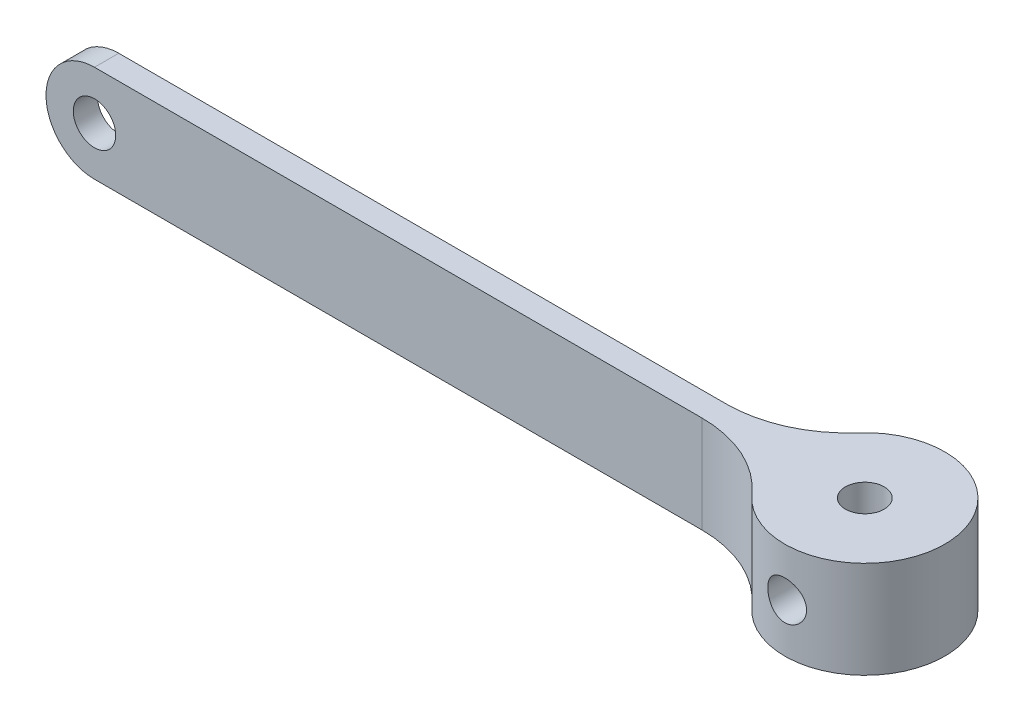
ISO-10303-21;
HEADER;
FILE_DESCRIPTION(('STEP AP214'),'2;1');
FILE_NAME('part.step','',(''),(''),'','','');
FILE_SCHEMA(('AUTOMOTIVE_DESIGN { 1 0 10303 214 1 1 1 1 }'));
ENDSEC;
DATA;
#1=APPLICATION_CONTEXT('core data for automotive mechanical design processes');
#2=APPLICATION_PROTOCOL_DEFINITION('international standard','automotive_design',2000,#1);
#3=PRODUCT_CONTEXT('',#1,'mechanical');
#4=PRODUCT('Part','Part','',(#3));
#5=PRODUCT_RELATED_PRODUCT_CATEGORY('part','',(#4));
#6=PRODUCT_DEFINITION_FORMATION('','',#4);
#7=PRODUCT_DEFINITION_CONTEXT('part definition',#1,'design');
#8=PRODUCT_DEFINITION('design','',#6,#7);
#9=PRODUCT_DEFINITION_SHAPE('','',#8);
#10=(LENGTH_UNIT() NAMED_UNIT(*) SI_UNIT(.MILLI.,.METRE.));
#11=(NAMED_UNIT(*) PLANE_ANGLE_UNIT() SI_UNIT($,.RADIAN.));
#12=(NAMED_UNIT(*) SI_UNIT($,.STERADIAN.) SOLID_ANGLE_UNIT());
#13=UNCERTAINTY_MEASURE_WITH_UNIT(LENGTH_MEASURE(1.E-05),#10,'distance_accuracy_value','');
#14=(GEOMETRIC_REPRESENTATION_CONTEXT(3) GLOBAL_UNCERTAINTY_ASSIGNED_CONTEXT((#13)) GLOBAL_UNIT_ASSIGNED_CONTEXT((#10,
#11,#12)) REPRESENTATION_CONTEXT('',''));
#15=CARTESIAN_POINT('',(0.,0.,0.));
#16=DIRECTION('',(0.,0.,1.));
#17=DIRECTION('',(1.,0.,0.));
#18=AXIS2_PLACEMENT_3D('',#15,#16,#17);
#19=CARTESIAN_POINT('',(0.,8.,-0.999999999999998));
#20=DIRECTION('',(0.,0.,-1.));
#21=DIRECTION('',(-1.,0.,0.));
#22=AXIS2_PLACEMENT_3D('',#19,#20,#21);
#23=PLANE('',#22);
#24=CARTESIAN_POINT('',(-62.52380257212,4.,-0.999999999999998));
#25=DIRECTION('',(0.,0.,-1.));
#26=DIRECTION('',(-1.,0.,0.));
#27=AXIS2_PLACEMENT_3D('',#24,#25,#26);
#28=CIRCLE('',#27,1.75);
#29=CARTESIAN_POINT('',(-60.77380257212,4.,-0.999999999999998));
#30=VERTEX_POINT('',#29);
#31=EDGE_CURVE('E208',#30,#30,#28,.T.);
#32=ORIENTED_EDGE('',*,*,#31,.F.);
#33=EDGE_LOOP('',(#32));
#34=FACE_BOUND('',#33,.T.);
#35=DIRECTION('',(1.,0.,0.));
#36=VECTOR('',#35,1.);
#37=CARTESIAN_POINT('',(0.,8.,-0.999999999999998));
#38=LINE('',#37,#36);
#39=CARTESIAN_POINT('',(-62.52380257212,8.,-1.));
#40=VERTEX_POINT('',#39);
#41=CARTESIAN_POINT('',(-12.432216214336,8.,-0.999999999999998));
#42=VERTEX_POINT('',#41);
#43=EDGE_CURVE('E299',#40,#42,#38,.T.);
#44=ORIENTED_EDGE('',*,*,#43,.T.);
#45=DIRECTION('',(0.,-1.,0.));
#46=VECTOR('',#45,1.);
#47=CARTESIAN_POINT('',(-12.432216214336,8.,-0.999999999999998));
#48=LINE('',#47,#46);
#49=CARTESIAN_POINT('',(-12.432216214336,0.,-0.999999999999998));
#50=VERTEX_POINT('',#49);
#51=EDGE_CURVE('E174',#42,#50,#48,.T.);
#52=ORIENTED_EDGE('',*,*,#51,.T.);
#53=DIRECTION('',(1.,0.,0.));
#54=VECTOR('',#53,1.);
#55=CARTESIAN_POINT('',(0.,0.,-0.999999999999998));
#56=LINE('',#55,#54);
#57=CARTESIAN_POINT('',(-62.52380257212,0.,-1.));
#58=VERTEX_POINT('',#57);
#59=EDGE_CURVE('E168',#58,#50,#56,.T.);
#60=ORIENTED_EDGE('',*,*,#59,.F.);
#61=CARTESIAN_POINT('',(-62.52380257212,4.,-0.999999999999998));
#62=DIRECTION('',(0.,0.,-1.));
#63=DIRECTION('',(-1.,0.,0.));
#64=AXIS2_PLACEMENT_3D('',#61,#62,#63);
#65=CIRCLE('',#64,4.);
#66=EDGE_CURVE('E152',#58,#40,#65,.T.);
#67=ORIENTED_EDGE('',*,*,#66,.T.);
#68=EDGE_LOOP('',(#44,#52,#60,#67));
#69=FACE_BOUND('',#68,.T.);
#70=ADVANCED_FACE('F92',(#34,#69),#23,.T.);
#71=CARTESIAN_POINT('',(0.,8.,1.));
#72=DIRECTION('',(0.,0.,-1.));
#73=DIRECTION('',(-1.,0.,0.));
#74=AXIS2_PLACEMENT_3D('',#71,#72,#73);
#75=PLANE('',#74);
#76=CARTESIAN_POINT('',(-62.52380257212,4.,1.));
#77=DIRECTION('',(0.,0.,-1.));
#78=DIRECTION('',(-1.,0.,0.));
#79=AXIS2_PLACEMENT_3D('',#76,#77,#78);
#80=CIRCLE('',#79,1.75);
#81=CARTESIAN_POINT('',(-60.77380257212,4.,1.));
#82=VERTEX_POINT('',#81);
#83=EDGE_CURVE('E204',#82,#82,#80,.T.);
#84=ORIENTED_EDGE('',*,*,#83,.T.);
#85=EDGE_LOOP('',(#84));
#86=FACE_BOUND('',#85,.T.);
#87=DIRECTION('',(1.,0.,0.));
#88=VECTOR('',#87,1.);
#89=CARTESIAN_POINT('',(0.,0.,1.));
#90=LINE('',#89,#88);
#91=CARTESIAN_POINT('',(-62.52380257212,0.,0.999999999999997));
#92=VERTEX_POINT('',#91);
#93=CARTESIAN_POINT('',(-12.432216214336,0.,1.));
#94=VERTEX_POINT('',#93);
#95=EDGE_CURVE('E170',#92,#94,#90,.T.);
#96=ORIENTED_EDGE('',*,*,#95,.T.);
#97=DIRECTION('',(0.,1.,0.));
#98=VECTOR('',#97,1.);
#99=CARTESIAN_POINT('',(-12.432216214336,8.,1.));
#100=LINE('',#99,#98);
#101=CARTESIAN_POINT('',(-12.432216214336,8.,1.));
#102=VERTEX_POINT('',#101);
#103=EDGE_CURVE('E216',#94,#102,#100,.T.);
#104=ORIENTED_EDGE('',*,*,#103,.T.);
#105=DIRECTION('',(1.,0.,0.));
#106=VECTOR('',#105,1.);
#107=CARTESIAN_POINT('',(0.,8.,1.));
#108=LINE('',#107,#106);
#109=CARTESIAN_POINT('',(-62.52380257212,8.,1.));
#110=VERTEX_POINT('',#109);
#111=EDGE_CURVE('E187',#110,#102,#108,.T.);
#112=ORIENTED_EDGE('',*,*,#111,.F.);
#113=CARTESIAN_POINT('',(-62.52380257212,4.,1.));
#114=DIRECTION('',(0.,0.,-1.));
#115=DIRECTION('',(-1.,0.,0.));
#116=AXIS2_PLACEMENT_3D('',#113,#114,#115);
#117=CIRCLE('',#116,4.);
#118=EDGE_CURVE('E163',#92,#110,#117,.T.);
#119=ORIENTED_EDGE('',*,*,#118,.F.);
#120=EDGE_LOOP('',(#96,#104,#112,#119));
#121=FACE_BOUND('',#120,.T.);
#122=ADVANCED_FACE('F240',(#86,#121),#75,.F.);
#123=CARTESIAN_POINT('',(0.,8.,0.));
#124=DIRECTION('',(0.,-1.,0.));
#125=DIRECTION('',(0.,0.,-1.));
#126=AXIS2_PLACEMENT_3D('',#123,#124,#125);
#127=CYLINDRICAL_SURFACE('',#126,1.6);
#128=CARTESIAN_POINT('',(0.,4.,0.));
#129=DIRECTION('',(0.,-0.707106781186548,0.707106781186547));
#130=DIRECTION('',(0.,-0.707106781186548,-0.707106781186547));
#131=AXIS2_PLACEMENT_3D('',#128,#129,#130);
#132=ELLIPSE('',#131,2.26274169979695,1.6);
#133=CARTESIAN_POINT('',(-1.6,4.,0.));
#134=VERTEX_POINT('',#133);
#135=CARTESIAN_POINT('',(1.6,4.,0.));
#136=VERTEX_POINT('',#135);
#137=EDGE_CURVE('E199',#134,#136,#132,.F.);
#138=ORIENTED_EDGE('',*,*,#137,.F.);
#139=CARTESIAN_POINT('',(0.,4.,0.));
#140=DIRECTION('',(0.,-0.707106781186548,-0.707106781186547));
#141=DIRECTION('',(0.,-0.707106781186548,0.707106781186547));
#142=AXIS2_PLACEMENT_3D('',#139,#140,#141);
#143=ELLIPSE('',#142,2.26274169979695,1.6);
#144=EDGE_CURVE('E172',#136,#134,#143,.F.);
#145=ORIENTED_EDGE('',*,*,#144,.F.);
#146=EDGE_LOOP('',(#138,#145));
#147=FACE_BOUND('',#146,.T.);
#148=CARTESIAN_POINT('',(0.,8.,0.));
#149=DIRECTION('',(0.,1.,0.));
#150=DIRECTION('',(0.,0.,1.));
#151=AXIS2_PLACEMENT_3D('',#148,#149,#150);
#152=CIRCLE('',#151,1.6);
#153=CARTESIAN_POINT('',(0.,8.,1.6));
#154=VERTEX_POINT('',#153);
#155=EDGE_CURVE('E180',#154,#154,#152,.T.);
#156=ORIENTED_EDGE('',*,*,#155,.T.);
#157=EDGE_LOOP('',(#156));
#158=FACE_BOUND('',#157,.T.);
#159=ADVANCED_FACE('F246',(#147,#158),#127,.F.);
#160=CARTESIAN_POINT('',(0.,0.,0.));
#161=DIRECTION('',(0.,1.,0.));
#162=DIRECTION('',(0.,0.,1.));
#163=AXIS2_PLACEMENT_3D('',#160,#161,#162);
#164=PLANE('',#163);
#165=CARTESIAN_POINT('',(0.,0.,0.));
#166=DIRECTION('',(0.,1.,0.));
#167=DIRECTION('',(0.,0.,1.));
#168=AXIS2_PLACEMENT_3D('',#165,#166,#167);
#169=CIRCLE('',#168,1.6);
#170=CARTESIAN_POINT('',(0.,0.,1.6));
#171=VERTEX_POINT('',#170);
#172=EDGE_CURVE('E162',#171,#171,#169,.T.);
#173=ORIENTED_EDGE('',*,*,#172,.T.);
#174=EDGE_LOOP('',(#173));
#175=FACE_BOUND('',#174,.T.);
#176=DIRECTION('',(0.,0.,1.));
#177=VECTOR('',#176,1.);
#178=CARTESIAN_POINT('',(-62.52380257212,0.,-6.6));
#179=LINE('',#178,#177);
#180=EDGE_CURVE('E155',#58,#92,#179,.T.);
#181=ORIENTED_EDGE('',*,*,#180,.F.);
#182=ORIENTED_EDGE('',*,*,#59,.T.);
#183=CARTESIAN_POINT('',(-12.432216214336,0.,-11.));
#184=DIRECTION('',(0.,1.,0.));
#185=DIRECTION('',(0.,0.,1.));
#186=AXIS2_PLACEMENT_3D('',#183,#184,#185);
#187=CIRCLE('',#186,10.);
#188=CARTESIAN_POINT('',(-4.94292933822999,0.,-4.37349397590361));
#189=VERTEX_POINT('',#188);
#190=EDGE_CURVE('E101',#50,#189,#187,.T.);
#191=ORIENTED_EDGE('',*,*,#190,.T.);
#192=CARTESIAN_POINT('',(0.,0.,0.));
#193=DIRECTION('',(0.,1.,0.));
#194=DIRECTION('',(0.,0.,1.));
#195=AXIS2_PLACEMENT_3D('',#192,#193,#194);
#196=CIRCLE('',#195,6.6);
#197=CARTESIAN_POINT('',(-4.94292933822999,0.,4.37349397590361));
#198=VERTEX_POINT('',#197);
#199=EDGE_CURVE('E176',#198,#189,#196,.T.);
#200=ORIENTED_EDGE('',*,*,#199,.F.);
#201=CARTESIAN_POINT('',(-12.432216214336,0.,11.));
#202=DIRECTION('',(0.,1.,0.));
#203=DIRECTION('',(0.,0.,1.));
#204=AXIS2_PLACEMENT_3D('',#201,#202,#203);
#205=CIRCLE('',#204,10.);
#206=EDGE_CURVE('E221',#198,#94,#205,.T.);
#207=ORIENTED_EDGE('',*,*,#206,.T.);
#208=ORIENTED_EDGE('',*,*,#95,.F.);
#209=EDGE_LOOP('',(#181,#182,#191,#200,#207,#208));
#210=FACE_BOUND('',#209,.T.);
#211=ADVANCED_FACE('F167',(#175,#210),#164,.F.);
#212=CARTESIAN_POINT('',(0.,8.,0.));
#213=DIRECTION('',(0.,1.,0.));
#214=DIRECTION('',(0.,0.,1.));
#215=AXIS2_PLACEMENT_3D('',#212,#213,#214);
#216=PLANE('',#215);
#217=ORIENTED_EDGE('',*,*,#155,.F.);
#218=EDGE_LOOP('',(#217));
#219=FACE_BOUND('',#218,.T.);
#220=ORIENTED_EDGE('',*,*,#43,.F.);
#221=DIRECTION('',(0.,0.,1.));
#222=VECTOR('',#221,1.);
#223=CARTESIAN_POINT('',(-62.52380257212,8.,-6.6));
#224=LINE('',#223,#222);
#225=EDGE_CURVE('E158',#40,#110,#224,.T.);
#226=ORIENTED_EDGE('',*,*,#225,.T.);
#227=ORIENTED_EDGE('',*,*,#111,.T.);
#228=CARTESIAN_POINT('',(-12.432216214336,8.,11.));
#229=DIRECTION('',(0.,1.,0.));
#230=DIRECTION('',(0.,0.,1.));
#231=AXIS2_PLACEMENT_3D('',#228,#229,#230);
#232=CIRCLE('',#231,10.);
#233=CARTESIAN_POINT('',(-4.94292933822999,8.,4.37349397590361));
#234=VERTEX_POINT('',#233);
#235=EDGE_CURVE('E224',#102,#234,#232,.F.);
#236=ORIENTED_EDGE('',*,*,#235,.T.);
#237=CARTESIAN_POINT('',(0.,8.,0.));
#238=DIRECTION('',(0.,1.,0.));
#239=DIRECTION('',(0.,0.,1.));
#240=AXIS2_PLACEMENT_3D('',#237,#238,#239);
#241=CIRCLE('',#240,6.6);
#242=CARTESIAN_POINT('',(-4.94292933822999,8.,-4.37349397590361));
#243=VERTEX_POINT('',#242);
#244=EDGE_CURVE('E302',#234,#243,#241,.T.);
#245=ORIENTED_EDGE('',*,*,#244,.T.);
#246=CARTESIAN_POINT('',(-12.432216214336,8.,-11.));
#247=DIRECTION('',(0.,1.,0.));
#248=DIRECTION('',(0.,0.,1.));
#249=AXIS2_PLACEMENT_3D('',#246,#247,#248);
#250=CIRCLE('',#249,10.);
#251=EDGE_CURVE('E12',#243,#42,#250,.F.);
#252=ORIENTED_EDGE('',*,*,#251,.T.);
#253=EDGE_LOOP('',(#220,#226,#227,#236,#245,#252));
#254=FACE_BOUND('',#253,.T.);
#255=ADVANCED_FACE('F256',(#219,#254),#216,.T.);
#256=CARTESIAN_POINT('',(0.,8.,0.));
#257=DIRECTION('',(0.,-1.,0.));
#258=DIRECTION('',(0.,0.,-1.));
#259=AXIS2_PLACEMENT_3D('',#256,#257,#258);
#260=CYLINDRICAL_SURFACE('',#259,6.6);
#261=CARTESIAN_POINT('',(1.6,4.,-6.40312423743285));
#262=CARTESIAN_POINT('',(1.59999733947836,4.08844402406098,-6.40312597037608));
#263=CARTESIAN_POINT('',(1.59264157848281,4.17691809600071,-6.40497670400887));
#264=CARTESIAN_POINT('',(1.56345601743318,4.35133182154082,-6.4121621325328));
#265=CARTESIAN_POINT('',(1.54161728105349,4.43726987614424,-6.41749897840401));
#266=CARTESIAN_POINT('',(1.48420900234039,4.60406355514517,-6.43101748536075));
#267=CARTESIAN_POINT('',(1.44865650524925,4.68492534448298,-6.43919561368331));
#268=CARTESIAN_POINT('',(1.3648810998873,4.83954379086885,-6.45747086045777));
#269=CARTESIAN_POINT('',(1.31665785249964,4.91330025767959,-6.46756803026843));
#270=CARTESIAN_POINT('',(1.20784389900135,5.05314159602282,-6.48877758318028));
#271=CARTESIAN_POINT('',(1.14703929913897,5.11905772455782,-6.49990538881894));
#272=CARTESIAN_POINT('',(1.01524965153105,5.23986289597431,-6.5217882988137));
#273=CARTESIAN_POINT('',(0.944263695721746,5.29475095422509,-6.53254336981968));
#274=CARTESIAN_POINT('',(0.792976530006599,5.39262652396975,-6.55263898037571));
#275=CARTESIAN_POINT('',(0.71256570600993,5.43544913714583,-6.56195919706409));
#276=CARTESIAN_POINT('',(0.545423893058168,5.50690743021361,-6.57795945463852));
#277=CARTESIAN_POINT('',(0.458693781262912,5.53554507478769,-6.5846398611243));
#278=CARTESIAN_POINT('',(0.28313343703087,5.57728248350463,-6.59449878121048));
#279=CARTESIAN_POINT('',(0.194374956348101,5.59066857236418,-6.59774174354862));
#280=CARTESIAN_POINT('',(0.0158168750524343,5.60242074593819,-6.60058464260181));
#281=CARTESIAN_POINT('',(-0.0739825787233717,5.60078892390197,-6.60018508702391));
#282=CARTESIAN_POINT('',(-0.25009076322241,5.5827593886002,-6.59583627033507));
#283=CARTESIAN_POINT('',(-0.336433231377963,5.56667061845232,-6.59196128200833));
#284=CARTESIAN_POINT('',(-0.505154519829912,5.52067938716169,-6.58118299179282));
#285=CARTESIAN_POINT('',(-0.587533136198652,5.49077621614884,-6.57427953428333));
#286=CARTESIAN_POINT('',(-0.746813265295441,5.41774922909505,-6.55810487467464));
#287=CARTESIAN_POINT('',(-0.8236614407911,5.37451366657421,-6.54881377443151));
#288=CARTESIAN_POINT('',(-0.969121094903154,5.27613357148008,-6.52887450690487));
#289=CARTESIAN_POINT('',(-1.03773121476807,5.22098707855287,-6.51822611635086));
#290=CARTESIAN_POINT('',(-1.16660863727456,5.09868762962085,-6.49641521034034));
#291=CARTESIAN_POINT('',(-1.22661882104947,5.03126455163238,-6.48524650824044));
#292=CARTESIAN_POINT('',(-1.33453585965573,4.88719490884861,-6.46390352969242));
#293=CARTESIAN_POINT('',(-1.38244221584308,4.81054796424765,-6.45372929422414));
#294=CARTESIAN_POINT('',(-1.46494322915083,4.64972470273884,-6.43550637883586));
#295=CARTESIAN_POINT('',(-1.4994794029305,4.56551724795948,-6.42746708453676));
#296=CARTESIAN_POINT('',(-1.55382718977604,4.39225039215391,-6.41454673226991));
#297=CARTESIAN_POINT('',(-1.57364174189015,4.30319196339657,-6.40966504393782));
#298=CARTESIAN_POINT('',(-1.59756435294379,4.12512682937485,-6.40374402358904));
#299=CARTESIAN_POINT('',(-1.60205110778769,4.03617402039503,-6.40261207062851));
#300=CARTESIAN_POINT('',(-1.59622462099622,3.85879092404816,-6.40406713975094));
#301=CARTESIAN_POINT('',(-1.58591265192973,3.77036059240891,-6.4066538420601));
#302=CARTESIAN_POINT('',(-1.55111264233716,3.59791634012609,-6.41516633208495));
#303=CARTESIAN_POINT('',(-1.52684202876438,3.51385577255964,-6.42104086992378));
#304=CARTESIAN_POINT('',(-1.46505330245464,3.35099563472862,-6.43541907577093));
#305=CARTESIAN_POINT('',(-1.427533693674,3.27219665978537,-6.44392304067414));
#306=CARTESIAN_POINT('',(-1.33950890361332,3.12048324751841,-6.46279907110407));
#307=CARTESIAN_POINT('',(-1.28877556385843,3.04770522515797,-6.47320288866304));
#308=CARTESIAN_POINT('',(-1.176054449739,2.91155642689974,-6.49462703788132));
#309=CARTESIAN_POINT('',(-1.11406494115952,2.84818710331931,-6.50564746435902));
#310=CARTESIAN_POINT('',(-0.978859243852804,2.73113684816081,-6.52737484171816));
#311=CARTESIAN_POINT('',(-0.905414542587484,2.6777169454476,-6.5380684476914));
#312=CARTESIAN_POINT('',(-0.750376177663217,2.58397023624514,-6.55766967940658));
#313=CARTESIAN_POINT('',(-0.66878293149163,2.54364275942034,-6.56657739657757));
#314=CARTESIAN_POINT('',(-0.500317828978865,2.47756489223356,-6.58154809251216));
#315=CARTESIAN_POINT('',(-0.413487967421984,2.45171216041208,-6.58763099011155));
#316=CARTESIAN_POINT('',(-0.236550277056997,2.41500676666825,-6.59635362322053));
#317=CARTESIAN_POINT('',(-0.146443043735652,2.40415139361489,-6.5989939810466));
#318=CARTESIAN_POINT('',(0.0320330834287466,2.39789370197624,-6.60051038370048));
#319=CARTESIAN_POINT('',(0.120387845166775,2.4021050810357,-6.59948053308083));
#320=CARTESIAN_POINT('',(0.295090603727326,2.42498180031035,-6.59397912156365));
#321=CARTESIAN_POINT('',(0.381438653778091,2.44364675669111,-6.58950765206303));
#322=CARTESIAN_POINT('',(0.549299070646439,2.49469887896567,-6.57763810488231));
#323=CARTESIAN_POINT('',(0.630832598167391,2.52701996018495,-6.57025413266408));
#324=CARTESIAN_POINT('',(0.787364816025318,2.60440616156891,-6.55333973860274));
#325=CARTESIAN_POINT('',(0.862362725594601,2.64947280163974,-6.54380906079289));
#326=CARTESIAN_POINT('',(1.00554031833552,2.75226967813651,-6.52336129617945));
#327=CARTESIAN_POINT('',(1.07352623332948,2.81026451788978,-6.51241761643753));
#328=CARTESIAN_POINT('',(1.19893242972994,2.93675265363601,-6.49050250288316));
#329=CARTESIAN_POINT('',(1.25635006733463,3.00524856878544,-6.47953106282008));
#330=CARTESIAN_POINT('',(1.35995880768537,3.15221778456658,-6.45858815699281));
#331=CARTESIAN_POINT('',(1.40593901379458,3.23084290180638,-6.448637221504));
#332=CARTESIAN_POINT('',(1.48395977964431,3.39493550764195,-6.43113315660768));
#333=CARTESIAN_POINT('',(1.51601091235572,3.48039774791219,-6.42357820968792));
#334=CARTESIAN_POINT('',(1.56024691692113,3.63814570603387,-6.41295817096726));
#335=CARTESIAN_POINT('',(1.57512286070378,3.70964864102359,-6.40929733413103));
#336=CARTESIAN_POINT('',(1.59500013121856,3.85409430607224,-6.40437974225737));
#337=CARTESIAN_POINT('',(1.60000219483265,3.92703692827776,-6.40312280781832));
#338=CARTESIAN_POINT('',(1.6,4.,-6.40312423743285));
#339=B_SPLINE_CURVE_WITH_KNOTS('',3,(#261,#262,#263,#264,#265,#266,#267,#268,#269,#270,#271,
#272,#273,#274,#275,#276,#277,#278,#279,#280,#281,#282,#283,#284,#285,#286,#287,#288,#289,#290,
#291,#292,#293,#294,#295,#296,#297,#298,#299,#300,#301,#302,#303,#304,#305,#306,#307,#308,#309,
#310,#311,#312,#313,#314,#315,#316,#317,#318,#319,#320,#321,#322,#323,#324,#325,#326,#327,#328,
#329,#330,#331,#332,#333,#334,#335,#336,#337,#338),.UNSPECIFIED.,.T.,.F.,(4,2,2,2,2,2,2,2,2,2,2,
2,2,2,2,2,2,2,2,2,2,2,2,2,2,2,2,2,2,2,2,2,2,2,2,2,2,2,4),(0.,0.265064273258436,
0.530292249566571,0.795191622869192,1.0600980865956,1.32994540119492,1.59981679815771,
1.87321504847942,2.14657542130955,2.41471463941518,2.68281648389817,2.94532180998148,
3.20784062672676,3.47262248908861,3.73744796368044,4.00902119378664,4.28060561013037,
4.55336490852977,4.82606973818099,5.09198626575298,5.35787992805489,5.619739930883,
5.88162951175322,6.1483813618781,6.41517434484027,6.68820231251325,6.96121629887957,
7.23227478485269,7.50328426411234,7.76739558504667,8.03149989238554,8.29434052625653,
8.55721251706291,8.82606066778539,9.09497598347789,9.36853321512672,9.64188243681685,
9.86056704862862,10.0792353395176),.UNSPECIFIED.);
#340=CARTESIAN_POINT('',(1.6,4.,-6.40312423743285));
#341=VERTEX_POINT('',#340);
#342=EDGE_CURVE('E209',#341,#341,#339,.T.);
#343=ORIENTED_EDGE('',*,*,#342,.T.);
#344=EDGE_LOOP('',(#343));
#345=FACE_BOUND('',#344,.T.);
#346=CARTESIAN_POINT('',(1.6,4.,6.40312423743285));
#347=CARTESIAN_POINT('',(1.59999733947836,3.91155597593902,6.40312597037608));
#348=CARTESIAN_POINT('',(1.59264157848281,3.82308190399929,6.40497670400887));
#349=CARTESIAN_POINT('',(1.56345601743318,3.64866817845918,6.4121621325328));
#350=CARTESIAN_POINT('',(1.54161728105349,3.56273012385576,6.41749897840401));
#351=CARTESIAN_POINT('',(1.48420900234039,3.39593644485483,6.43101748536075));
#352=CARTESIAN_POINT('',(1.44865650524925,3.31507465551702,6.43919561368331));
#353=CARTESIAN_POINT('',(1.3648810998873,3.16045620913115,6.45747086045777));
#354=CARTESIAN_POINT('',(1.31665785249964,3.08669974232041,6.46756803026843));
#355=CARTESIAN_POINT('',(1.20784389900135,2.94685840397718,6.48877758318028));
#356=CARTESIAN_POINT('',(1.14703929913897,2.88094227544218,6.49990538881894));
#357=CARTESIAN_POINT('',(1.01524965153105,2.76013710402569,6.5217882988137));
#358=CARTESIAN_POINT('',(0.944263695721746,2.70524904577491,6.53254336981968));
#359=CARTESIAN_POINT('',(0.792976530006598,2.60737347603025,6.55263898037571));
#360=CARTESIAN_POINT('',(0.712565706009929,2.56455086285417,6.56195919706409));
#361=CARTESIAN_POINT('',(0.545423893058167,2.49309256978639,6.57795945463852));
#362=CARTESIAN_POINT('',(0.458693781262911,2.46445492521231,6.5846398611243));
#363=CARTESIAN_POINT('',(0.283133437030869,2.42271751649537,6.59449878121048));
#364=CARTESIAN_POINT('',(0.1943749563481,2.40933142763582,6.59774174354862));
#365=CARTESIAN_POINT('',(0.0158168750524331,2.39757925406181,6.60058464260181));
#366=CARTESIAN_POINT('',(-0.073982578723373,2.39921107609803,6.60018508702391));
#367=CARTESIAN_POINT('',(-0.250090763222411,2.4172406113998,6.59583627033507));
#368=CARTESIAN_POINT('',(-0.336433231377964,2.43332938154768,6.59196128200833));
#369=CARTESIAN_POINT('',(-0.505154519829913,2.47932061283831,6.58118299179282));
#370=CARTESIAN_POINT('',(-0.587533136198654,2.50922378385116,6.57427953428333));
#371=CARTESIAN_POINT('',(-0.746813265295443,2.58225077090495,6.55810487467464));
#372=CARTESIAN_POINT('',(-0.823661440791102,2.62548633342579,6.54881377443151));
#373=CARTESIAN_POINT('',(-0.969121094903156,2.72386642851992,6.52887450690487));
#374=CARTESIAN_POINT('',(-1.03773121476807,2.77901292144713,6.51822611635086));
#375=CARTESIAN_POINT('',(-1.16660863727457,2.90131237037916,6.49641521034034));
#376=CARTESIAN_POINT('',(-1.22661882104947,2.96873544836762,6.48524650824044));
#377=CARTESIAN_POINT('',(-1.33453585965573,3.11280509115139,6.46390352969242));
#378=CARTESIAN_POINT('',(-1.38244221584308,3.18945203575236,6.45372929422414));
#379=CARTESIAN_POINT('',(-1.46494322915083,3.35027529726117,6.43550637883586));
#380=CARTESIAN_POINT('',(-1.4994794029305,3.43448275204052,6.42746708453676));
#381=CARTESIAN_POINT('',(-1.55382718977604,3.60774960784609,6.41454673226991));
#382=CARTESIAN_POINT('',(-1.57364174189015,3.69680803660343,6.40966504393782));
#383=CARTESIAN_POINT('',(-1.59756435294379,3.87487317062515,6.40374402358904));
#384=CARTESIAN_POINT('',(-1.60205110778769,3.96382597960497,6.40261207062851));
#385=CARTESIAN_POINT('',(-1.59622462099622,4.14120907595185,6.40406713975094));
#386=CARTESIAN_POINT('',(-1.58591265192973,4.22963940759109,6.4066538420601));
#387=CARTESIAN_POINT('',(-1.55111264233716,4.40208365987391,6.41516633208495));
#388=CARTESIAN_POINT('',(-1.52684202876438,4.48614422744036,6.42104086992378));
#389=CARTESIAN_POINT('',(-1.46505330245464,4.64900436527138,6.43541907577093));
#390=CARTESIAN_POINT('',(-1.427533693674,4.72780334021463,6.44392304067414));
#391=CARTESIAN_POINT('',(-1.33950890361332,4.87951675248159,6.46279907110407));
#392=CARTESIAN_POINT('',(-1.28877556385843,4.95229477484203,6.47320288866304));
#393=CARTESIAN_POINT('',(-1.176054449739,5.08844357310027,6.49462703788132));
#394=CARTESIAN_POINT('',(-1.11406494115952,5.15181289668069,6.50564746435902));
#395=CARTESIAN_POINT('',(-0.978859243852804,5.2688631518392,6.52737484171816));
#396=CARTESIAN_POINT('',(-0.905414542587483,5.3222830545524,6.5380684476914));
#397=CARTESIAN_POINT('',(-0.750376177663216,5.41602976375486,6.55766967940658));
#398=CARTESIAN_POINT('',(-0.66878293149163,5.45635724057966,6.56657739657757));
#399=CARTESIAN_POINT('',(-0.500317828978864,5.52243510776645,6.58154809251216));
#400=CARTESIAN_POINT('',(-0.413487967421984,5.54828783958792,6.58763099011155));
#401=CARTESIAN_POINT('',(-0.236550277056997,5.58499323333175,6.59635362322053));
#402=CARTESIAN_POINT('',(-0.146443043735651,5.59584860638511,6.5989939810466));
#403=CARTESIAN_POINT('',(0.0320330834287479,5.60210629802376,6.60051038370048));
#404=CARTESIAN_POINT('',(0.120387845166776,5.5978949189643,6.59948053308083));
#405=CARTESIAN_POINT('',(0.295090603727328,5.57501819968965,6.59397912156365));
#406=CARTESIAN_POINT('',(0.381438653778093,5.55635324330889,6.58950765206303));
#407=CARTESIAN_POINT('',(0.549299070646441,5.50530112103433,6.57763810488231));
#408=CARTESIAN_POINT('',(0.630832598167393,5.47298003981504,6.57025413266408));
#409=CARTESIAN_POINT('',(0.787364816025321,5.39559383843108,6.55333973860274));
#410=CARTESIAN_POINT('',(0.862362725594603,5.35052719836026,6.54380906079289));
#411=CARTESIAN_POINT('',(1.00554031833552,5.24773032186349,6.52336129617945));
#412=CARTESIAN_POINT('',(1.07352623332948,5.18973548211022,6.51241761643753));
#413=CARTESIAN_POINT('',(1.19893242972994,5.06324734636399,6.49050250288316));
#414=CARTESIAN_POINT('',(1.25635006733463,4.99475143121456,6.47953106282008));
#415=CARTESIAN_POINT('',(1.35995880768537,4.84778221543341,6.45858815699281));
#416=CARTESIAN_POINT('',(1.40593901379458,4.76915709819361,6.448637221504));
#417=CARTESIAN_POINT('',(1.48395977964431,4.60506449235805,6.43113315660768));
#418=CARTESIAN_POINT('',(1.51601091235572,4.51960225208781,6.42357820968792));
#419=CARTESIAN_POINT('',(1.56024691692113,4.36185429396613,6.41295817096726));
#420=CARTESIAN_POINT('',(1.57512286070378,4.29035135897641,6.40929733413103));
#421=CARTESIAN_POINT('',(1.59500013121856,4.14590569392776,6.40437974225737));
#422=CARTESIAN_POINT('',(1.60000219483265,4.07296307172224,6.40312280781832));
#423=CARTESIAN_POINT('',(1.6,4.,6.40312423743285));
#424=B_SPLINE_CURVE_WITH_KNOTS('',3,(#346,#347,#348,#349,#350,#351,#352,#353,#354,#355,#356,
#357,#358,#359,#360,#361,#362,#363,#364,#365,#366,#367,#368,#369,#370,#371,#372,#373,#374,#375,
#376,#377,#378,#379,#380,#381,#382,#383,#384,#385,#386,#387,#388,#389,#390,#391,#392,#393,#394,
#395,#396,#397,#398,#399,#400,#401,#402,#403,#404,#405,#406,#407,#408,#409,#410,#411,#412,#413,
#414,#415,#416,#417,#418,#419,#420,#421,#422,#423),.UNSPECIFIED.,.T.,.F.,(4,2,2,2,2,2,2,2,2,2,2,
2,2,2,2,2,2,2,2,2,2,2,2,2,2,2,2,2,2,2,2,2,2,2,2,2,2,2,4),(0.,0.265064273258436,
0.530292249566571,0.795191622869192,1.0600980865956,1.32994540119492,1.59981679815771,
1.87321504847942,2.14657542130955,2.41471463941518,2.68281648389817,2.94532180998148,
3.20784062672676,3.47262248908861,3.73744796368044,4.00902119378665,4.28060561013037,
4.55336490852977,4.82606973818099,5.09198626575298,5.3578799280549,5.619739930883,
5.88162951175322,6.1483813618781,6.41517434484028,6.68820231251325,6.96121629887958,
7.23227478485269,7.50328426411234,7.76739558504667,8.03149989238554,8.29434052625654,
8.55721251706292,8.82606066778539,9.0949759834779,9.36853321512673,9.64188243681686,
9.86056704862863,10.0792353395176),.UNSPECIFIED.);
#425=CARTESIAN_POINT('',(1.6,4.,6.40312423743285));
#426=VERTEX_POINT('',#425);
#427=EDGE_CURVE('E260',#426,#426,#424,.T.);
#428=ORIENTED_EDGE('',*,*,#427,.T.);
#429=EDGE_LOOP('',(#428));
#430=FACE_BOUND('',#429,.T.);
#431=ORIENTED_EDGE('',*,*,#244,.F.);
#432=DIRECTION('',(0.,-1.,0.));
#433=VECTOR('',#432,1.);
#434=CARTESIAN_POINT('',(-4.94292933822999,8.,4.37349397590361));
#435=LINE('',#434,#433);
#436=EDGE_CURVE('E212',#234,#198,#435,.T.);
#437=ORIENTED_EDGE('',*,*,#436,.T.);
#438=ORIENTED_EDGE('',*,*,#199,.T.);
#439=DIRECTION('',(0.,-1.,0.));
#440=VECTOR('',#439,1.);
#441=CARTESIAN_POINT('',(-4.94292933822999,8.,-4.37349397590361));
#442=LINE('',#441,#440);
#443=EDGE_CURVE('E203',#189,#243,#442,.F.);
#444=ORIENTED_EDGE('',*,*,#443,.T.);
#445=EDGE_LOOP('',(#431,#437,#438,#444));
#446=FACE_BOUND('',#445,.T.);
#447=ADVANCED_FACE('F230',(#345,#430,#446),#260,.T.);
#448=CARTESIAN_POINT('',(0.,4.,0.));
#449=DIRECTION('',(0.,-0.707106781186548,0.707106781186547));
#450=DIRECTION('',(0.,-0.707106781186548,-0.707106781186547));
#451=AXIS2_PLACEMENT_3D('',#448,#449,#450);
#452=ELLIPSE('',#451,2.26274169979695,1.6);
#453=EDGE_CURVE('E195',#134,#136,#452,.T.);
#454=ORIENTED_EDGE('',*,*,#453,.F.);
#455=CARTESIAN_POINT('',(0.,4.,0.));
#456=DIRECTION('',(0.,-0.707106781186548,-0.707106781186547));
#457=DIRECTION('',(0.,-0.707106781186548,0.707106781186547));
#458=AXIS2_PLACEMENT_3D('',#455,#456,#457);
#459=ELLIPSE('',#458,2.26274169979695,1.6);
#460=EDGE_CURVE('E192',#136,#134,#459,.T.);
#461=ORIENTED_EDGE('',*,*,#460,.F.);
#462=EDGE_LOOP('',(#454,#461));
#463=FACE_BOUND('',#462,.T.);
#464=ORIENTED_EDGE('',*,*,#172,.F.);
#465=EDGE_LOOP('',(#464));
#466=FACE_BOUND('',#465,.T.);
#467=ADVANCED_FACE('F255',(#463,#466),#127,.F.);
#468=CARTESIAN_POINT('',(-62.52380257212,4.,-6.6));
#469=DIRECTION('',(0.,0.,1.));
#470=DIRECTION('',(1.,0.,0.));
#471=AXIS2_PLACEMENT_3D('',#468,#469,#470);
#472=CYLINDRICAL_SURFACE('',#471,4.);
#473=ORIENTED_EDGE('',*,*,#66,.F.);
#474=ORIENTED_EDGE('',*,*,#180,.T.);
#475=ORIENTED_EDGE('',*,*,#118,.T.);
#476=ORIENTED_EDGE('',*,*,#225,.F.);
#477=EDGE_LOOP('',(#473,#474,#475,#476));
#478=FACE_BOUND('',#477,.T.);
#479=ADVANCED_FACE('F154',(#478),#472,.T.);
#480=CARTESIAN_POINT('',(0.,4.,-6.6));
#481=DIRECTION('',(0.,0.,1.));
#482=DIRECTION('',(1.,0.,0.));
#483=AXIS2_PLACEMENT_3D('',#480,#481,#482);
#484=CYLINDRICAL_SURFACE('',#483,1.6);
#485=ORIENTED_EDGE('',*,*,#453,.T.);
#486=ORIENTED_EDGE('',*,*,#144,.T.);
#487=EDGE_LOOP('',(#485,#486));
#488=FACE_BOUND('',#487,.T.);
#489=ORIENTED_EDGE('',*,*,#342,.F.);
#490=EDGE_LOOP('',(#489));
#491=FACE_BOUND('',#490,.T.);
#492=ADVANCED_FACE('F273',(#488,#491),#484,.F.);
#493=ORIENTED_EDGE('',*,*,#137,.T.);
#494=ORIENTED_EDGE('',*,*,#460,.T.);
#495=EDGE_LOOP('',(#493,#494));
#496=FACE_BOUND('',#495,.T.);
#497=ORIENTED_EDGE('',*,*,#427,.F.);
#498=EDGE_LOOP('',(#497));
#499=FACE_BOUND('',#498,.T.);
#500=ADVANCED_FACE('F278',(#496,#499),#484,.F.);
#501=CARTESIAN_POINT('',(-62.52380257212,4.,-6.6));
#502=DIRECTION('',(0.,0.,1.));
#503=DIRECTION('',(1.,0.,0.));
#504=AXIS2_PLACEMENT_3D('',#501,#502,#503);
#505=CYLINDRICAL_SURFACE('',#504,1.75);
#506=CARTESIAN_POINT('',(-60.77380257212,4.,-0.999999999999998));
#507=CARTESIAN_POINT('',(-60.77380257212,4.,-0.979166666666665));
#508=CARTESIAN_POINT('',(-60.77380257212,4.,-0.958333333333332));
#509=CARTESIAN_POINT('',(-60.77380257212,4.,-0.916666666666665));
#510=CARTESIAN_POINT('',(-60.77380257212,4.,-0.895833333333331));
#511=CARTESIAN_POINT('',(-60.77380257212,4.,-0.854166666666665));
#512=CARTESIAN_POINT('',(-60.77380257212,4.,-0.833333333333331));
#513=CARTESIAN_POINT('',(-60.77380257212,4.,-0.791666666666665));
#514=CARTESIAN_POINT('',(-60.77380257212,4.,-0.770833333333331));
#515=CARTESIAN_POINT('',(-60.77380257212,4.,-0.729166666666665));
#516=CARTESIAN_POINT('',(-60.77380257212,4.,-0.708333333333331));
#517=CARTESIAN_POINT('',(-60.77380257212,4.,-0.666666666666665));
#518=CARTESIAN_POINT('',(-60.77380257212,4.,-0.645833333333331));
#519=CARTESIAN_POINT('',(-60.77380257212,4.,-0.604166666666665));
#520=CARTESIAN_POINT('',(-60.77380257212,4.,-0.583333333333331));
#521=CARTESIAN_POINT('',(-60.77380257212,4.,-0.541666666666665));
#522=CARTESIAN_POINT('',(-60.77380257212,4.,-0.520833333333331));
#523=CARTESIAN_POINT('',(-60.77380257212,4.,-0.479166666666664));
#524=CARTESIAN_POINT('',(-60.77380257212,4.,-0.458333333333331));
#525=CARTESIAN_POINT('',(-60.77380257212,4.,-0.416666666666665));
#526=CARTESIAN_POINT('',(-60.77380257212,4.,-0.395833333333332));
#527=CARTESIAN_POINT('',(-60.77380257212,4.,-0.354166666666665));
#528=CARTESIAN_POINT('',(-60.77380257212,4.,-0.333333333333332));
#529=CARTESIAN_POINT('',(-60.77380257212,4.,-0.291666666666665));
#530=CARTESIAN_POINT('',(-60.77380257212,4.,-0.270833333333332));
#531=CARTESIAN_POINT('',(-60.77380257212,4.,-0.229166666666665));
#532=CARTESIAN_POINT('',(-60.77380257212,4.,-0.208333333333332));
#533=CARTESIAN_POINT('',(-60.77380257212,4.,-0.166666666666665));
#534=CARTESIAN_POINT('',(-60.77380257212,4.,-0.145833333333332));
#535=CARTESIAN_POINT('',(-60.77380257212,4.,-0.104166666666665));
#536=CARTESIAN_POINT('',(-60.77380257212,4.,-0.0833333333333317));
#537=CARTESIAN_POINT('',(-60.77380257212,4.,-0.041666666666665));
#538=CARTESIAN_POINT('',(-60.77380257212,4.,-0.0208333333333316));
#539=CARTESIAN_POINT('',(-60.77380257212,4.,0.0208333333333351));
#540=CARTESIAN_POINT('',(-60.77380257212,4.,0.0416666666666684));
#541=CARTESIAN_POINT('',(-60.77380257212,4.,0.0833333333333351));
#542=CARTESIAN_POINT('',(-60.77380257212,4.,0.104166666666668));
#543=CARTESIAN_POINT('',(-60.77380257212,4.,0.145833333333335));
#544=CARTESIAN_POINT('',(-60.77380257212,4.,0.166666666666669));
#545=CARTESIAN_POINT('',(-60.77380257212,4.,0.208333333333335));
#546=CARTESIAN_POINT('',(-60.77380257212,4.,0.229166666666669));
#547=CARTESIAN_POINT('',(-60.77380257212,4.,0.270833333333335));
#548=CARTESIAN_POINT('',(-60.77380257212,4.,0.291666666666669));
#549=CARTESIAN_POINT('',(-60.77380257212,4.,0.333333333333335));
#550=CARTESIAN_POINT('',(-60.77380257212,4.,0.354166666666668));
#551=CARTESIAN_POINT('',(-60.77380257212,4.,0.395833333333335));
#552=CARTESIAN_POINT('',(-60.77380257212,4.,0.416666666666668));
#553=CARTESIAN_POINT('',(-60.77380257212,4.,0.458333333333335));
#554=CARTESIAN_POINT('',(-60.77380257212,4.,0.479166666666668));
#555=CARTESIAN_POINT('',(-60.77380257212,4.,0.520833333333335));
#556=CARTESIAN_POINT('',(-60.77380257212,4.,0.541666666666668));
#557=CARTESIAN_POINT('',(-60.77380257212,4.,0.583333333333335));
#558=CARTESIAN_POINT('',(-60.77380257212,4.,0.604166666666668));
#559=CARTESIAN_POINT('',(-60.77380257212,4.,0.645833333333335));
#560=CARTESIAN_POINT('',(-60.77380257212,4.,0.666666666666668));
#561=CARTESIAN_POINT('',(-60.77380257212,4.,0.708333333333335));
#562=CARTESIAN_POINT('',(-60.77380257212,4.,0.729166666666668));
#563=CARTESIAN_POINT('',(-60.77380257212,4.,0.770833333333335));
#564=CARTESIAN_POINT('',(-60.77380257212,4.,0.791666666666668));
#565=CARTESIAN_POINT('',(-60.77380257212,4.,0.833333333333335));
#566=CARTESIAN_POINT('',(-60.77380257212,4.,0.854166666666668));
#567=CARTESIAN_POINT('',(-60.77380257212,4.,0.895833333333335));
#568=CARTESIAN_POINT('',(-60.77380257212,4.,0.916666666666668));
#569=CARTESIAN_POINT('',(-60.77380257212,4.,0.958333333333335));
#570=CARTESIAN_POINT('',(-60.77380257212,4.,0.979166666666668));
#571=CARTESIAN_POINT('',(-60.77380257212,4.,1.));
#572=B_SPLINE_CURVE_WITH_KNOTS('',3,(#506,#507,#508,#509,#510,#511,#512,#513,#514,#515,#516,
#517,#518,#519,#520,#521,#522,#523,#524,#525,#526,#527,#528,#529,#530,#531,#532,#533,#534,#535,
#536,#537,#538,#539,#540,#541,#542,#543,#544,#545,#546,#547,#548,#549,#550,#551,#552,#553,#554,
#555,#556,#557,#558,#559,#560,#561,#562,#563,#564,#565,#566,#567,#568,#569,#570,#571),
.UNSPECIFIED.,.F.,.F.,(4,2,2,2,2,2,2,2,2,2,2,2,2,2,2,2,2,2,2,2,2,2,2,2,2,2,2,2,2,2,2,2,4),(0.,
0.0625000000000001,0.125,0.1875,0.25,0.3125,0.375,0.4375,0.5,0.5625,0.625,0.6875,0.75,0.8125,
0.875,0.9375,1.,1.0625,1.125,1.1875,1.25,1.3125,1.375,1.4375,1.5,1.5625,1.625,1.6875,1.75,
1.8125,1.875,1.9375,2.),.UNSPECIFIED.);
#573=EDGE_CURVE('BSEAM237',#30,#82,#572,.T.);
#574=ORIENTED_EDGE('',*,*,#31,.T.);
#575=ORIENTED_EDGE('',*,*,#83,.F.);
#576=ORIENTED_EDGE('',*,*,#573,.T.);
#577=ORIENTED_EDGE('',*,*,#573,.F.);
#578=EDGE_LOOP('',(#574,#576,#575,#577));
#579=FACE_BOUND('',#578,.T.);
#580=ADVANCED_FACE('F237',(#579),#505,.F.);
#581=CARTESIAN_POINT('',(-12.432216214336,8.,11.));
#582=DIRECTION('',(0.,-1.,0.));
#583=DIRECTION('',(0.,0.,-1.));
#584=AXIS2_PLACEMENT_3D('',#581,#582,#583);
#585=CYLINDRICAL_SURFACE('',#584,10.);
#586=ORIENTED_EDGE('',*,*,#235,.F.);
#587=ORIENTED_EDGE('',*,*,#103,.F.);
#588=ORIENTED_EDGE('',*,*,#206,.F.);
#589=ORIENTED_EDGE('',*,*,#436,.F.);
#590=EDGE_LOOP('',(#586,#587,#588,#589));
#591=FACE_BOUND('',#590,.T.);
#592=ADVANCED_FACE('F233',(#591),#585,.F.);
#593=CARTESIAN_POINT('',(-12.432216214336,8.,-11.));
#594=DIRECTION('',(0.,-1.,0.));
#595=DIRECTION('',(0.,0.,-1.));
#596=AXIS2_PLACEMENT_3D('',#593,#594,#595);
#597=CYLINDRICAL_SURFACE('',#596,10.);
#598=ORIENTED_EDGE('',*,*,#251,.F.);
#599=ORIENTED_EDGE('',*,*,#443,.F.);
#600=ORIENTED_EDGE('',*,*,#190,.F.);
#601=ORIENTED_EDGE('',*,*,#51,.F.);
#602=EDGE_LOOP('',(#598,#599,#600,#601));
#603=FACE_BOUND('',#602,.T.);
#604=ADVANCED_FACE('F94',(#603),#597,.F.);
#605=CLOSED_SHELL('',(#70,#122,#159,#211,#255,#447,#467,#479,#492,#500,#580,#592,#604));
#606=MANIFOLD_SOLID_BREP('B2',#605);
#607=ADVANCED_BREP_SHAPE_REPRESENTATION('',(#18,#606),#14);
#608=SHAPE_DEFINITION_REPRESENTATION(#9,#607);
ENDSEC;
END-ISO-10303-21;
